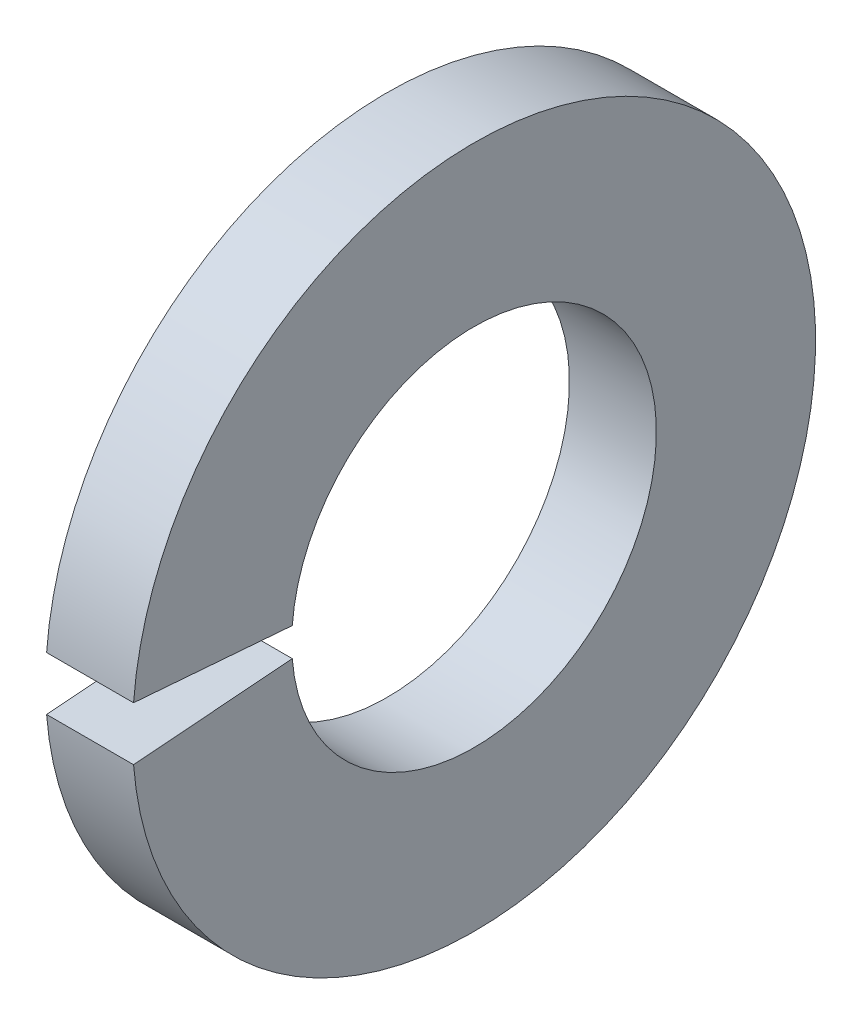
ISO-10303-21;
HEADER;
FILE_DESCRIPTION(('STEP AP214'),'2;1');
FILE_NAME('part.step','',(''),(''),'','','');
FILE_SCHEMA(('AUTOMOTIVE_DESIGN { 1 0 10303 214 1 1 1 1 }'));
ENDSEC;
DATA;
#1=APPLICATION_CONTEXT('core data for automotive mechanical design processes');
#2=APPLICATION_PROTOCOL_DEFINITION('international standard','automotive_design',2000,#1);
#3=PRODUCT_CONTEXT('',#1,'mechanical');
#4=PRODUCT('Part','Part','',(#3));
#5=PRODUCT_RELATED_PRODUCT_CATEGORY('part','',(#4));
#6=PRODUCT_DEFINITION_FORMATION('','',#4);
#7=PRODUCT_DEFINITION_CONTEXT('part definition',#1,'design');
#8=PRODUCT_DEFINITION('design','',#6,#7);
#9=PRODUCT_DEFINITION_SHAPE('','',#8);
#10=(LENGTH_UNIT() NAMED_UNIT(*) SI_UNIT(.MILLI.,.METRE.));
#11=(NAMED_UNIT(*) PLANE_ANGLE_UNIT() SI_UNIT($,.RADIAN.));
#12=(NAMED_UNIT(*) SI_UNIT($,.STERADIAN.) SOLID_ANGLE_UNIT());
#13=UNCERTAINTY_MEASURE_WITH_UNIT(LENGTH_MEASURE(1.E-05),#10,'distance_accuracy_value','');
#14=(GEOMETRIC_REPRESENTATION_CONTEXT(3) GLOBAL_UNCERTAINTY_ASSIGNED_CONTEXT((#13)) GLOBAL_UNIT_ASSIGNED_CONTEXT((#10,
#11,#12)) REPRESENTATION_CONTEXT('',''));
#15=CARTESIAN_POINT('',(0.,0.,0.));
#16=DIRECTION('',(0.,0.,1.));
#17=DIRECTION('',(1.,0.,0.));
#18=AXIS2_PLACEMENT_3D('',#15,#16,#17);
#19=CARTESIAN_POINT('',(-1.5748,0.259071934093342,3.29182103598679));
#20=DIRECTION('',(-1.,0.,0.));
#21=DIRECTION('',(0.,0.,1.));
#22=AXIS2_PLACEMENT_3D('',#19,#20,#21);
#23=PLANE('',#22);
#24=CARTESIAN_POINT('',(-1.5748,0.,0.));
#25=DIRECTION('',(-1.,0.,0.));
#26=DIRECTION('',(0.,0.,1.));
#27=AXIS2_PLACEMENT_3D('',#24,#25,#26);
#28=CIRCLE('',#27,3.302);
#29=CARTESIAN_POINT('',(-1.5748,0.259071934093342,3.29182103598679));
#30=VERTEX_POINT('',#29);
#31=CARTESIAN_POINT('',(-1.5748,-0.259071934093346,3.29182103598679));
#32=VERTEX_POINT('',#31);
#33=EDGE_CURVE('E11',#30,#32,#28,.T.);
#34=ORIENTED_EDGE('',*,*,#33,.F.);
#35=DIRECTION('',(0.,0.0784590957278445,0.996917333733128));
#36=VECTOR('',#35,1.);
#37=CARTESIAN_POINT('',(-1.5748,0.259071934093342,3.29182103598679));
#38=LINE('',#37,#36);
#39=CARTESIAN_POINT('',(-1.5748,0.485261661167145,6.16583401740602));
#40=VERTEX_POINT('',#39);
#41=EDGE_CURVE('E74',#30,#40,#38,.T.);
#42=ORIENTED_EDGE('',*,*,#41,.T.);
#43=CARTESIAN_POINT('',(-1.5748,0.,0.));
#44=DIRECTION('',(-1.,0.,0.));
#45=DIRECTION('',(0.,0.,1.));
#46=AXIS2_PLACEMENT_3D('',#43,#44,#45);
#47=CIRCLE('',#46,6.1849);
#48=CARTESIAN_POINT('',(-1.5748,-0.485261661167152,6.16583401740602));
#49=VERTEX_POINT('',#48);
#50=EDGE_CURVE('E69',#40,#49,#47,.T.);
#51=ORIENTED_EDGE('',*,*,#50,.T.);
#52=DIRECTION('',(0.,-0.0784590957278456,0.996917333733128));
#53=VECTOR('',#52,1.);
#54=CARTESIAN_POINT('',(-1.5748,-0.259071934093346,3.29182103598679));
#55=LINE('',#54,#53);
#56=EDGE_CURVE('E72',#32,#49,#55,.T.);
#57=ORIENTED_EDGE('',*,*,#56,.F.);
#58=EDGE_LOOP('',(#34,#42,#51,#57));
#59=FACE_BOUND('',#58,.T.);
#60=ADVANCED_FACE('F33',(#59),#23,.T.);
#61=CARTESIAN_POINT('',(0.,0.,0.));
#62=DIRECTION('',(-1.,0.,0.));
#63=DIRECTION('',(0.,0.,1.));
#64=AXIS2_PLACEMENT_3D('',#61,#62,#63);
#65=CYLINDRICAL_SURFACE('',#64,3.302);
#66=CARTESIAN_POINT('',(0.,0.,0.));
#67=DIRECTION('',(-1.,0.,0.));
#68=DIRECTION('',(0.,0.,1.));
#69=AXIS2_PLACEMENT_3D('',#66,#67,#68);
#70=CIRCLE('',#69,3.302);
#71=CARTESIAN_POINT('',(0.,0.259071934093342,3.29182103598679));
#72=VERTEX_POINT('',#71);
#73=CARTESIAN_POINT('',(0.,-0.259071934093346,3.29182103598679));
#74=VERTEX_POINT('',#73);
#75=EDGE_CURVE('E41',#72,#74,#70,.T.);
#76=ORIENTED_EDGE('',*,*,#75,.F.);
#77=DIRECTION('',(-1.,0.,0.));
#78=VECTOR('',#77,1.);
#79=CARTESIAN_POINT('',(0.,0.259071934093342,3.29182103598679));
#80=LINE('',#79,#78);
#81=EDGE_CURVE('E79',#72,#30,#80,.T.);
#82=ORIENTED_EDGE('',*,*,#81,.T.);
#83=ORIENTED_EDGE('',*,*,#33,.T.);
#84=DIRECTION('',(-1.,0.,0.));
#85=VECTOR('',#84,1.);
#86=CARTESIAN_POINT('',(0.,-0.259071934093346,3.29182103598679));
#87=LINE('',#86,#85);
#88=EDGE_CURVE('E91',#74,#32,#87,.T.);
#89=ORIENTED_EDGE('',*,*,#88,.F.);
#90=EDGE_LOOP('',(#76,#82,#83,#89));
#91=FACE_BOUND('',#90,.T.);
#92=ADVANCED_FACE('F35',(#91),#65,.F.);
#93=CARTESIAN_POINT('',(0.,0.485261661167145,6.16583401740602));
#94=DIRECTION('',(1.,0.,0.));
#95=DIRECTION('',(0.,0.,-1.));
#96=AXIS2_PLACEMENT_3D('',#93,#94,#95);
#97=PLANE('',#96);
#98=CARTESIAN_POINT('',(0.,0.,0.));
#99=DIRECTION('',(-1.,0.,0.));
#100=DIRECTION('',(0.,0.,1.));
#101=AXIS2_PLACEMENT_3D('',#98,#99,#100);
#102=CIRCLE('',#101,6.1849);
#103=CARTESIAN_POINT('',(0.,0.485261661167145,6.16583401740602));
#104=VERTEX_POINT('',#103);
#105=CARTESIAN_POINT('',(0.,-0.485261661167152,6.16583401740602));
#106=VERTEX_POINT('',#105);
#107=EDGE_CURVE('E78',#104,#106,#102,.T.);
#108=ORIENTED_EDGE('',*,*,#107,.F.);
#109=DIRECTION('',(0.,-0.0784590957278445,-0.996917333733128));
#110=VECTOR('',#109,1.);
#111=CARTESIAN_POINT('',(0.,0.485261661167145,6.16583401740602));
#112=LINE('',#111,#110);
#113=EDGE_CURVE('E99',#104,#72,#112,.T.);
#114=ORIENTED_EDGE('',*,*,#113,.T.);
#115=ORIENTED_EDGE('',*,*,#75,.T.);
#116=DIRECTION('',(0.,0.0784590957278456,-0.996917333733128));
#117=VECTOR('',#116,1.);
#118=CARTESIAN_POINT('',(0.,-0.485261661167152,6.16583401740602));
#119=LINE('',#118,#117);
#120=EDGE_CURVE('E87',#106,#74,#119,.T.);
#121=ORIENTED_EDGE('',*,*,#120,.F.);
#122=EDGE_LOOP('',(#108,#114,#115,#121));
#123=FACE_BOUND('',#122,.T.);
#124=ADVANCED_FACE('F103',(#123),#97,.T.);
#125=CARTESIAN_POINT('',(0.,0.,0.));
#126=DIRECTION('',(-1.,0.,0.));
#127=DIRECTION('',(0.,0.,1.));
#128=AXIS2_PLACEMENT_3D('',#125,#126,#127);
#129=CYLINDRICAL_SURFACE('',#128,6.1849);
#130=DIRECTION('',(1.,0.,0.));
#131=VECTOR('',#130,1.);
#132=CARTESIAN_POINT('',(-1.5748,0.485261661167145,6.16583401740602));
#133=LINE('',#132,#131);
#134=EDGE_CURVE('E97',#40,#104,#133,.T.);
#135=ORIENTED_EDGE('',*,*,#134,.T.);
#136=ORIENTED_EDGE('',*,*,#107,.T.);
#137=DIRECTION('',(1.,0.,0.));
#138=VECTOR('',#137,1.);
#139=CARTESIAN_POINT('',(-1.5748,-0.485261661167152,6.16583401740602));
#140=LINE('',#139,#138);
#141=EDGE_CURVE('E82',#49,#106,#140,.T.);
#142=ORIENTED_EDGE('',*,*,#141,.F.);
#143=ORIENTED_EDGE('',*,*,#50,.F.);
#144=EDGE_LOOP('',(#135,#136,#142,#143));
#145=FACE_BOUND('',#144,.T.);
#146=ADVANCED_FACE('F83',(#145),#129,.T.);
#147=CARTESIAN_POINT('',(0.,0.,0.));
#148=DIRECTION('',(0.,0.996917333733128,-0.0784590957278445));
#149=DIRECTION('',(0.,0.0784590957278445,0.996917333733128));
#150=AXIS2_PLACEMENT_3D('',#147,#148,#149);
#151=PLANE('',#150);
#152=ORIENTED_EDGE('',*,*,#41,.F.);
#153=ORIENTED_EDGE('',*,*,#81,.F.);
#154=ORIENTED_EDGE('',*,*,#113,.F.);
#155=ORIENTED_EDGE('',*,*,#134,.F.);
#156=EDGE_LOOP('',(#152,#153,#154,#155));
#157=FACE_BOUND('',#156,.T.);
#158=ADVANCED_FACE('F107',(#157),#151,.F.);
#159=CARTESIAN_POINT('',(0.,0.,0.));
#160=DIRECTION('',(0.,0.996917333733128,0.0784590957278457));
#161=DIRECTION('',(0.,-0.0784590957278457,0.996917333733128));
#162=AXIS2_PLACEMENT_3D('',#159,#160,#161);
#163=PLANE('',#162);
#164=ORIENTED_EDGE('',*,*,#56,.T.);
#165=ORIENTED_EDGE('',*,*,#141,.T.);
#166=ORIENTED_EDGE('',*,*,#120,.T.);
#167=ORIENTED_EDGE('',*,*,#88,.T.);
#168=EDGE_LOOP('',(#164,#165,#166,#167));
#169=FACE_BOUND('',#168,.T.);
#170=ADVANCED_FACE('F90',(#169),#163,.T.);
#171=CLOSED_SHELL('',(#60,#92,#124,#146,#158,#170));
#172=MANIFOLD_SOLID_BREP('B2',#171);
#173=ADVANCED_BREP_SHAPE_REPRESENTATION('',(#18,#172),#14);
#174=SHAPE_DEFINITION_REPRESENTATION(#9,#173);
ENDSEC;
END-ISO-10303-21;
